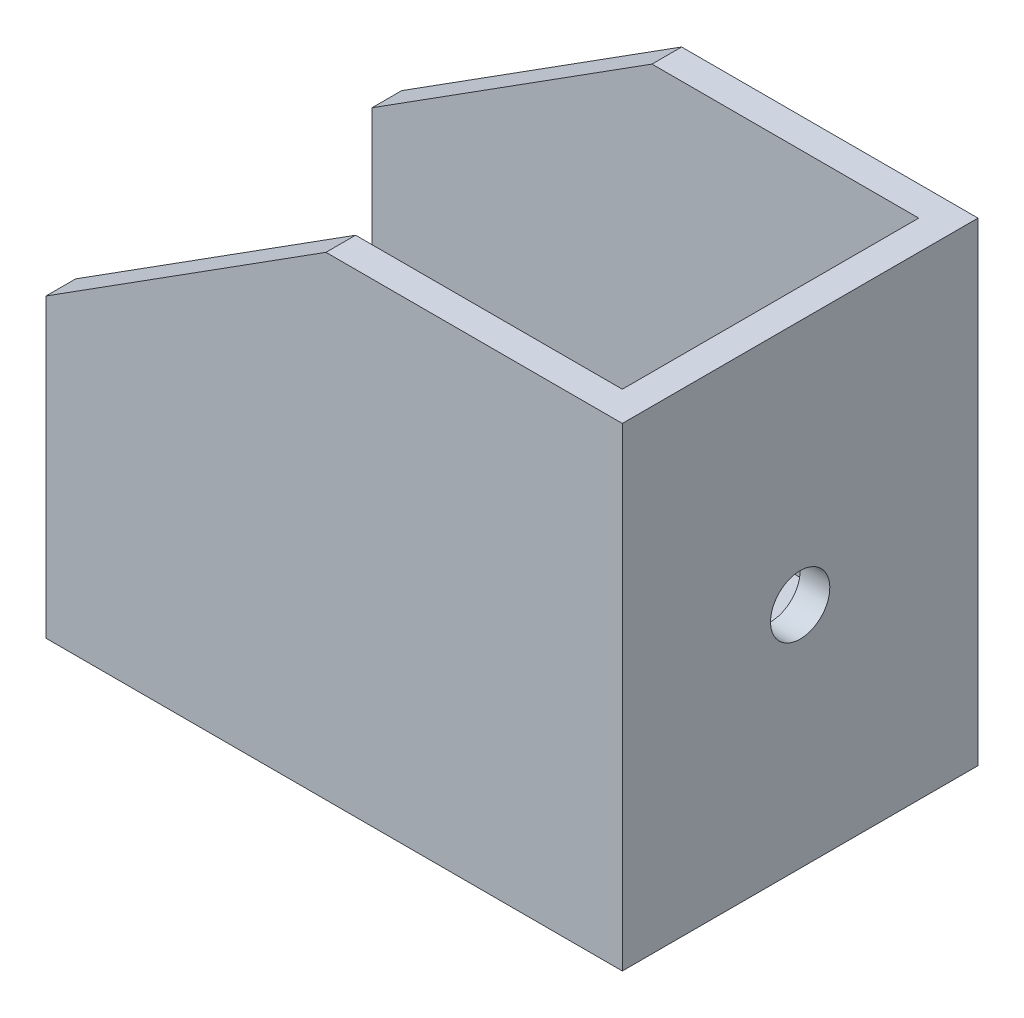
ISO-10303-21;
HEADER;
FILE_DESCRIPTION(('STEP AP214'),'2;1');
FILE_NAME('part.step','',(''),(''),'','','');
FILE_SCHEMA(('AUTOMOTIVE_DESIGN { 1 0 10303 214 1 1 1 1 }'));
ENDSEC;
DATA;
#1=APPLICATION_CONTEXT('core data for automotive mechanical design processes');
#2=APPLICATION_PROTOCOL_DEFINITION('international standard','automotive_design',2000,#1);
#3=PRODUCT_CONTEXT('',#1,'mechanical');
#4=PRODUCT('Part','Part','',(#3));
#5=PRODUCT_RELATED_PRODUCT_CATEGORY('part','',(#4));
#6=PRODUCT_DEFINITION_FORMATION('','',#4);
#7=PRODUCT_DEFINITION_CONTEXT('part definition',#1,'design');
#8=PRODUCT_DEFINITION('design','',#6,#7);
#9=PRODUCT_DEFINITION_SHAPE('','',#8);
#10=(LENGTH_UNIT() NAMED_UNIT(*) SI_UNIT(.MILLI.,.METRE.));
#11=(NAMED_UNIT(*) PLANE_ANGLE_UNIT() SI_UNIT($,.RADIAN.));
#12=(NAMED_UNIT(*) SI_UNIT($,.STERADIAN.) SOLID_ANGLE_UNIT());
#13=UNCERTAINTY_MEASURE_WITH_UNIT(LENGTH_MEASURE(1.E-05),#10,'distance_accuracy_value','');
#14=(GEOMETRIC_REPRESENTATION_CONTEXT(3) GLOBAL_UNCERTAINTY_ASSIGNED_CONTEXT((#13)) GLOBAL_UNIT_ASSIGNED_CONTEXT((#10,
#11,#12)) REPRESENTATION_CONTEXT('',''));
#15=CARTESIAN_POINT('',(0.,0.,0.));
#16=DIRECTION('',(0.,0.,1.));
#17=DIRECTION('',(1.,0.,0.));
#18=AXIS2_PLACEMENT_3D('',#15,#16,#17);
#19=CARTESIAN_POINT('',(47.2258862129138,0.,60.));
#20=DIRECTION('',(0.536067929963821,-0.844174848277479,0.));
#21=DIRECTION('',(0.844174848277479,0.536067929963821,0.));
#22=AXIS2_PLACEMENT_3D('',#19,#20,#21);
#23=PLANE('',#22);
#24=DIRECTION('',(0.844174848277479,0.536067929963821,0.));
#25=VECTOR('',#24,1.);
#26=CARTESIAN_POINT('',(47.2258862129138,0.,5.));
#27=LINE('',#26,#25);
#28=CARTESIAN_POINT('',(0.,-29.9893832593106,5.));
#29=VERTEX_POINT('',#28);
#30=CARTESIAN_POINT('',(47.2258862129138,0.,5.));
#31=VERTEX_POINT('',#30);
#32=EDGE_CURVE('E131',#29,#31,#27,.T.);
#33=ORIENTED_EDGE('',*,*,#32,.T.);
#34=DIRECTION('',(0.,0.,-1.));
#35=VECTOR('',#34,1.);
#36=CARTESIAN_POINT('',(47.2258862129138,0.,60.));
#37=LINE('',#36,#35);
#38=CARTESIAN_POINT('',(47.2258862129138,0.,0.));
#39=VERTEX_POINT('',#38);
#40=EDGE_CURVE('E116',#31,#39,#37,.T.);
#41=ORIENTED_EDGE('',*,*,#40,.T.);
#42=DIRECTION('',(-0.844174848277479,-0.536067929963821,0.));
#43=VECTOR('',#42,1.);
#44=CARTESIAN_POINT('',(47.2258862129138,0.,0.));
#45=LINE('',#44,#43);
#46=CARTESIAN_POINT('',(0.,-29.9893832593106,0.));
#47=VERTEX_POINT('',#46);
#48=EDGE_CURVE('E134',#39,#47,#45,.T.);
#49=ORIENTED_EDGE('',*,*,#48,.T.);
#50=DIRECTION('',(0.,0.,-1.));
#51=VECTOR('',#50,1.);
#52=CARTESIAN_POINT('',(0.,-29.9893832593106,60.));
#53=LINE('',#52,#51);
#54=EDGE_CURVE('E117',#29,#47,#53,.T.);
#55=ORIENTED_EDGE('',*,*,#54,.F.);
#56=EDGE_LOOP('',(#33,#41,#49,#55));
#57=FACE_BOUND('',#56,.T.);
#58=ADVANCED_FACE('F33',(#57),#23,.F.);
#59=CARTESIAN_POINT('',(97.2258862129138,0.,60.));
#60=DIRECTION('',(-1.,0.,0.));
#61=DIRECTION('',(0.,-1.,0.));
#62=AXIS2_PLACEMENT_3D('',#59,#60,#61);
#63=PLANE('',#62);
#64=CARTESIAN_POINT('',(97.2258862129138,-41.5,30.));
#65=DIRECTION('',(-1.,0.,0.));
#66=DIRECTION('',(0.,-1.,0.));
#67=AXIS2_PLACEMENT_3D('',#64,#65,#66);
#68=CIRCLE('',#67,5.);
#69=CARTESIAN_POINT('',(97.2258862129138,-46.5,30.));
#70=VERTEX_POINT('',#69);
#71=EDGE_CURVE('E180',#70,#70,#68,.T.);
#72=ORIENTED_EDGE('',*,*,#71,.T.);
#73=EDGE_LOOP('',(#72));
#74=FACE_BOUND('',#73,.T.);
#75=DIRECTION('',(0.,1.,0.));
#76=VECTOR('',#75,1.);
#77=CARTESIAN_POINT('',(97.2258862129138,0.,0.));
#78=LINE('',#77,#76);
#79=CARTESIAN_POINT('',(97.2258862129138,-80.,0.));
#80=VERTEX_POINT('',#79);
#81=CARTESIAN_POINT('',(97.2258862129138,0.,0.));
#82=VERTEX_POINT('',#81);
#83=EDGE_CURVE('E127',#80,#82,#78,.T.);
#84=ORIENTED_EDGE('',*,*,#83,.T.);
#85=DIRECTION('',(0.,0.,-1.));
#86=VECTOR('',#85,1.);
#87=CARTESIAN_POINT('',(97.2258862129138,0.,60.));
#88=LINE('',#87,#86);
#89=CARTESIAN_POINT('',(97.2258862129138,0.,60.));
#90=VERTEX_POINT('',#89);
#91=EDGE_CURVE('E42',#90,#82,#88,.T.);
#92=ORIENTED_EDGE('',*,*,#91,.F.);
#93=DIRECTION('',(0.,1.,0.));
#94=VECTOR('',#93,1.);
#95=CARTESIAN_POINT('',(97.2258862129138,0.,60.));
#96=LINE('',#95,#94);
#97=CARTESIAN_POINT('',(97.2258862129138,-80.,60.));
#98=VERTEX_POINT('',#97);
#99=EDGE_CURVE('E140',#98,#90,#96,.T.);
#100=ORIENTED_EDGE('',*,*,#99,.F.);
#101=DIRECTION('',(0.,0.,-1.));
#102=VECTOR('',#101,1.);
#103=CARTESIAN_POINT('',(97.2258862129138,-80.,60.));
#104=LINE('',#103,#102);
#105=EDGE_CURVE('E123',#98,#80,#104,.T.);
#106=ORIENTED_EDGE('',*,*,#105,.T.);
#107=EDGE_LOOP('',(#84,#92,#100,#106));
#108=FACE_BOUND('',#107,.T.);
#109=ADVANCED_FACE('F35',(#74,#108),#63,.F.);
#110=CARTESIAN_POINT('',(97.2258862129138,0.,60.));
#111=DIRECTION('',(0.,-1.,0.));
#112=DIRECTION('',(1.,0.,0.));
#113=AXIS2_PLACEMENT_3D('',#110,#111,#112);
#114=PLANE('',#113);
#115=ORIENTED_EDGE('',*,*,#40,.F.);
#116=DIRECTION('',(-1.,0.,0.));
#117=VECTOR('',#116,1.);
#118=CARTESIAN_POINT('',(30.7088178413558,0.,5.));
#119=LINE('',#118,#117);
#120=CARTESIAN_POINT('',(92.2258862129138,0.,5.));
#121=VERTEX_POINT('',#120);
#122=EDGE_CURVE('E164',#121,#31,#119,.T.);
#123=ORIENTED_EDGE('',*,*,#122,.F.);
#124=DIRECTION('',(0.,0.,-1.));
#125=VECTOR('',#124,1.);
#126=CARTESIAN_POINT('',(92.2258862129138,0.,5.));
#127=LINE('',#126,#125);
#128=CARTESIAN_POINT('',(92.2258862129138,0.,55.));
#129=VERTEX_POINT('',#128);
#130=EDGE_CURVE('E207',#129,#121,#127,.T.);
#131=ORIENTED_EDGE('',*,*,#130,.F.);
#132=DIRECTION('',(1.,0.,0.));
#133=VECTOR('',#132,1.);
#134=CARTESIAN_POINT('',(30.7088178413558,0.,55.));
#135=LINE('',#134,#133);
#136=CARTESIAN_POINT('',(47.2258862129138,0.,55.));
#137=VERTEX_POINT('',#136);
#138=EDGE_CURVE('E206',#137,#129,#135,.T.);
#139=ORIENTED_EDGE('',*,*,#138,.F.);
#140=CARTESIAN_POINT('',(47.2258862129138,0.,60.));
#141=VERTEX_POINT('',#140);
#142=EDGE_CURVE('E143',#141,#137,#37,.T.);
#143=ORIENTED_EDGE('',*,*,#142,.F.);
#144=DIRECTION('',(-1.,0.,0.));
#145=VECTOR('',#144,1.);
#146=CARTESIAN_POINT('',(97.2258862129138,0.,60.));
#147=LINE('',#146,#145);
#148=EDGE_CURVE('E91',#90,#141,#147,.T.);
#149=ORIENTED_EDGE('',*,*,#148,.F.);
#150=ORIENTED_EDGE('',*,*,#91,.T.);
#151=DIRECTION('',(-1.,0.,0.));
#152=VECTOR('',#151,1.);
#153=CARTESIAN_POINT('',(97.2258862129138,0.,0.));
#154=LINE('',#153,#152);
#155=EDGE_CURVE('E130',#82,#39,#154,.T.);
#156=ORIENTED_EDGE('',*,*,#155,.T.);
#157=EDGE_LOOP('',(#115,#123,#131,#139,#143,#149,#150,#156));
#158=FACE_BOUND('',#157,.T.);
#159=ADVANCED_FACE('F147',(#158),#114,.F.);
#160=ORIENTED_EDGE('',*,*,#142,.T.);
#161=DIRECTION('',(-0.844174848277479,-0.536067929963821,0.));
#162=VECTOR('',#161,1.);
#163=CARTESIAN_POINT('',(47.2258862129138,0.,55.));
#164=LINE('',#163,#162);
#165=CARTESIAN_POINT('',(0.,-29.9893832593106,55.));
#166=VERTEX_POINT('',#165);
#167=EDGE_CURVE('E112',#137,#166,#164,.T.);
#168=ORIENTED_EDGE('',*,*,#167,.T.);
#169=CARTESIAN_POINT('',(0.,-29.9893832593106,60.));
#170=VERTEX_POINT('',#169);
#171=EDGE_CURVE('E108',#170,#166,#53,.T.);
#172=ORIENTED_EDGE('',*,*,#171,.F.);
#173=DIRECTION('',(-0.844174848277479,-0.536067929963821,0.));
#174=VECTOR('',#173,1.);
#175=CARTESIAN_POINT('',(47.2258862129138,0.,60.));
#176=LINE('',#175,#174);
#177=EDGE_CURVE('E97',#141,#170,#176,.T.);
#178=ORIENTED_EDGE('',*,*,#177,.F.);
#179=EDGE_LOOP('',(#160,#168,#172,#178));
#180=FACE_BOUND('',#179,.T.);
#181=ADVANCED_FACE('F109',(#180),#23,.F.);
#182=CARTESIAN_POINT('',(0.,-29.9893832593106,60.));
#183=DIRECTION('',(1.,0.,0.));
#184=DIRECTION('',(0.,1.,0.));
#185=AXIS2_PLACEMENT_3D('',#182,#183,#184);
#186=PLANE('',#185);
#187=DIRECTION('',(0.,0.,1.));
#188=VECTOR('',#187,1.);
#189=CARTESIAN_POINT('',(0.,-62.5,5.));
#190=LINE('',#189,#188);
#191=CARTESIAN_POINT('',(0.,-62.5,5.));
#192=VERTEX_POINT('',#191);
#193=CARTESIAN_POINT('',(0.,-62.5,55.));
#194=VERTEX_POINT('',#193);
#195=EDGE_CURVE('E177',#192,#194,#190,.T.);
#196=ORIENTED_EDGE('',*,*,#195,.F.);
#197=DIRECTION('',(0.,1.,0.));
#198=VECTOR('',#197,1.);
#199=CARTESIAN_POINT('',(0.,-29.9893832593106,5.));
#200=LINE('',#199,#198);
#201=EDGE_CURVE('E11',#192,#29,#200,.T.);
#202=ORIENTED_EDGE('',*,*,#201,.T.);
#203=ORIENTED_EDGE('',*,*,#54,.T.);
#204=DIRECTION('',(0.,-1.,0.));
#205=VECTOR('',#204,1.);
#206=CARTESIAN_POINT('',(0.,-29.9893832593106,0.));
#207=LINE('',#206,#205);
#208=CARTESIAN_POINT('',(0.,-80.,0.));
#209=VERTEX_POINT('',#208);
#210=EDGE_CURVE('E137',#47,#209,#207,.T.);
#211=ORIENTED_EDGE('',*,*,#210,.T.);
#212=DIRECTION('',(0.,0.,-1.));
#213=VECTOR('',#212,1.);
#214=CARTESIAN_POINT('',(0.,-80.,60.));
#215=LINE('',#214,#213);
#216=CARTESIAN_POINT('',(0.,-80.,60.));
#217=VERTEX_POINT('',#216);
#218=EDGE_CURVE('E121',#217,#209,#215,.T.);
#219=ORIENTED_EDGE('',*,*,#218,.F.);
#220=DIRECTION('',(0.,-1.,0.));
#221=VECTOR('',#220,1.);
#222=CARTESIAN_POINT('',(0.,-29.9893832593106,60.));
#223=LINE('',#222,#221);
#224=EDGE_CURVE('E101',#170,#217,#223,.T.);
#225=ORIENTED_EDGE('',*,*,#224,.F.);
#226=ORIENTED_EDGE('',*,*,#171,.T.);
#227=DIRECTION('',(0.,1.,0.));
#228=VECTOR('',#227,1.);
#229=CARTESIAN_POINT('',(0.,-62.5,55.));
#230=LINE('',#229,#228);
#231=EDGE_CURVE('E178',#194,#166,#230,.T.);
#232=ORIENTED_EDGE('',*,*,#231,.F.);
#233=EDGE_LOOP('',(#196,#202,#203,#211,#219,#225,#226,#232));
#234=FACE_BOUND('',#233,.T.);
#235=ADVANCED_FACE('F120',(#234),#186,.F.);
#236=CARTESIAN_POINT('',(0.,-80.,60.));
#237=DIRECTION('',(0.,1.,0.));
#238=DIRECTION('',(0.,0.,1.));
#239=AXIS2_PLACEMENT_3D('',#236,#237,#238);
#240=PLANE('',#239);
#241=CARTESIAN_POINT('',(82.2258862129138,-80.,15.));
#242=DIRECTION('',(0.,1.,0.));
#243=DIRECTION('',(-1.,0.,0.));
#244=AXIS2_PLACEMENT_3D('',#241,#242,#243);
#245=CIRCLE('',#244,1.5);
#246=CARTESIAN_POINT('',(80.7258862129138,-80.,15.));
#247=VERTEX_POINT('',#246);
#248=EDGE_CURVE('E346',#247,#247,#245,.T.);
#249=ORIENTED_EDGE('',*,*,#248,.T.);
#250=EDGE_LOOP('',(#249));
#251=FACE_BOUND('',#250,.T.);
#252=CARTESIAN_POINT('',(10.,-80.,45.));
#253=DIRECTION('',(0.,1.,0.));
#254=DIRECTION('',(-1.,0.,0.));
#255=AXIS2_PLACEMENT_3D('',#252,#253,#254);
#256=CIRCLE('',#255,1.5);
#257=CARTESIAN_POINT('',(8.50000000000001,-80.,45.));
#258=VERTEX_POINT('',#257);
#259=EDGE_CURVE('E350',#258,#258,#256,.T.);
#260=ORIENTED_EDGE('',*,*,#259,.T.);
#261=EDGE_LOOP('',(#260));
#262=FACE_BOUND('',#261,.T.);
#263=CARTESIAN_POINT('',(82.2258862129138,-80.,45.));
#264=DIRECTION('',(0.,1.,0.));
#265=DIRECTION('',(-1.,0.,0.));
#266=AXIS2_PLACEMENT_3D('',#263,#264,#265);
#267=CIRCLE('',#266,1.5);
#268=CARTESIAN_POINT('',(80.7258862129138,-80.,45.));
#269=VERTEX_POINT('',#268);
#270=EDGE_CURVE('E361',#269,#269,#267,.T.);
#271=ORIENTED_EDGE('',*,*,#270,.T.);
#272=EDGE_LOOP('',(#271));
#273=FACE_BOUND('',#272,.T.);
#274=CARTESIAN_POINT('',(10.,-80.,15.));
#275=DIRECTION('',(0.,1.,0.));
#276=DIRECTION('',(-1.,0.,0.));
#277=AXIS2_PLACEMENT_3D('',#274,#275,#276);
#278=CIRCLE('',#277,1.5);
#279=CARTESIAN_POINT('',(8.50000000000001,-80.,15.));
#280=VERTEX_POINT('',#279);
#281=EDGE_CURVE('E208',#280,#280,#278,.T.);
#282=ORIENTED_EDGE('',*,*,#281,.T.);
#283=EDGE_LOOP('',(#282));
#284=FACE_BOUND('',#283,.T.);
#285=DIRECTION('',(1.,0.,0.));
#286=VECTOR('',#285,1.);
#287=CARTESIAN_POINT('',(0.,-80.,0.));
#288=LINE('',#287,#286);
#289=EDGE_CURVE('E82',#209,#80,#288,.T.);
#290=ORIENTED_EDGE('',*,*,#289,.T.);
#291=ORIENTED_EDGE('',*,*,#105,.F.);
#292=DIRECTION('',(1.,0.,0.));
#293=VECTOR('',#292,1.);
#294=CARTESIAN_POINT('',(0.,-80.,60.));
#295=LINE('',#294,#293);
#296=EDGE_CURVE('E58',#217,#98,#295,.T.);
#297=ORIENTED_EDGE('',*,*,#296,.F.);
#298=ORIENTED_EDGE('',*,*,#218,.T.);
#299=EDGE_LOOP('',(#290,#291,#297,#298));
#300=FACE_BOUND('',#299,.T.);
#301=ADVANCED_FACE('F248',(#251,#262,#273,#284,#300),#240,.F.);
#302=CARTESIAN_POINT('',(0.,0.,60.));
#303=DIRECTION('',(0.,0.,1.));
#304=DIRECTION('',(1.,0.,0.));
#305=AXIS2_PLACEMENT_3D('',#302,#303,#304);
#306=PLANE('',#305);
#307=ORIENTED_EDGE('',*,*,#99,.T.);
#308=ORIENTED_EDGE('',*,*,#148,.T.);
#309=ORIENTED_EDGE('',*,*,#177,.T.);
#310=ORIENTED_EDGE('',*,*,#224,.T.);
#311=ORIENTED_EDGE('',*,*,#296,.T.);
#312=EDGE_LOOP('',(#307,#308,#309,#310,#311));
#313=FACE_BOUND('',#312,.T.);
#314=ADVANCED_FACE('F99',(#313),#306,.T.);
#315=CARTESIAN_POINT('',(0.,0.,0.));
#316=DIRECTION('',(0.,0.,1.));
#317=DIRECTION('',(1.,0.,0.));
#318=AXIS2_PLACEMENT_3D('',#315,#316,#317);
#319=PLANE('',#318);
#320=ORIENTED_EDGE('',*,*,#83,.F.);
#321=ORIENTED_EDGE('',*,*,#289,.F.);
#322=ORIENTED_EDGE('',*,*,#210,.F.);
#323=ORIENTED_EDGE('',*,*,#48,.F.);
#324=ORIENTED_EDGE('',*,*,#155,.F.);
#325=EDGE_LOOP('',(#320,#321,#322,#323,#324));
#326=FACE_BOUND('',#325,.T.);
#327=ADVANCED_FACE('F153',(#326),#319,.F.);
#328=CARTESIAN_POINT('',(80.,-62.5,5.));
#329=DIRECTION('',(0.,0.,-1.));
#330=DIRECTION('',(-1.,0.,0.));
#331=AXIS2_PLACEMENT_3D('',#328,#329,#330);
#332=PLANE('',#331);
#333=ORIENTED_EDGE('',*,*,#122,.T.);
#334=ORIENTED_EDGE('',*,*,#32,.F.);
#335=ORIENTED_EDGE('',*,*,#201,.F.);
#336=DIRECTION('',(-1.,0.,0.));
#337=VECTOR('',#336,1.);
#338=CARTESIAN_POINT('',(80.,-62.5,5.));
#339=LINE('',#338,#337);
#340=CARTESIAN_POINT('',(92.2258862129138,-62.5,5.));
#341=VERTEX_POINT('',#340);
#342=EDGE_CURVE('E49',#341,#192,#339,.T.);
#343=ORIENTED_EDGE('',*,*,#342,.F.);
#344=DIRECTION('',(0.,1.,0.));
#345=VECTOR('',#344,1.);
#346=CARTESIAN_POINT('',(92.2258862129138,-62.5,5.));
#347=LINE('',#346,#345);
#348=EDGE_CURVE('E215',#341,#121,#347,.T.);
#349=ORIENTED_EDGE('',*,*,#348,.T.);
#350=EDGE_LOOP('',(#333,#334,#335,#343,#349));
#351=FACE_BOUND('',#350,.T.);
#352=ADVANCED_FACE('F174',(#351),#332,.F.);
#353=CARTESIAN_POINT('',(80.,-62.5,55.));
#354=DIRECTION('',(0.,0.,1.));
#355=DIRECTION('',(1.,0.,0.));
#356=AXIS2_PLACEMENT_3D('',#353,#354,#355);
#357=PLANE('',#356);
#358=ORIENTED_EDGE('',*,*,#167,.F.);
#359=ORIENTED_EDGE('',*,*,#138,.T.);
#360=DIRECTION('',(0.,1.,0.));
#361=VECTOR('',#360,1.);
#362=CARTESIAN_POINT('',(92.2258862129138,-62.5,55.));
#363=LINE('',#362,#361);
#364=CARTESIAN_POINT('',(92.2258862129138,-62.5,55.));
#365=VERTEX_POINT('',#364);
#366=EDGE_CURVE('E197',#365,#129,#363,.T.);
#367=ORIENTED_EDGE('',*,*,#366,.F.);
#368=DIRECTION('',(-1.,0.,0.));
#369=VECTOR('',#368,1.);
#370=CARTESIAN_POINT('',(80.,-62.5,55.));
#371=LINE('',#370,#369);
#372=EDGE_CURVE('E187',#365,#194,#371,.T.);
#373=ORIENTED_EDGE('',*,*,#372,.T.);
#374=ORIENTED_EDGE('',*,*,#231,.T.);
#375=EDGE_LOOP('',(#358,#359,#367,#373,#374));
#376=FACE_BOUND('',#375,.T.);
#377=ADVANCED_FACE('F193',(#376),#357,.F.);
#378=CARTESIAN_POINT('',(80.,-62.5,5.));
#379=DIRECTION('',(0.,-1.,0.));
#380=DIRECTION('',(1.,0.,0.));
#381=AXIS2_PLACEMENT_3D('',#378,#379,#380);
#382=PLANE('',#381);
#383=CARTESIAN_POINT('',(82.2258862129138,-62.5,15.));
#384=DIRECTION('',(0.,1.,0.));
#385=DIRECTION('',(-1.,0.,0.));
#386=AXIS2_PLACEMENT_3D('',#383,#384,#385);
#387=CIRCLE('',#386,1.5);
#388=CARTESIAN_POINT('',(80.7258862129138,-62.5,15.));
#389=VERTEX_POINT('',#388);
#390=EDGE_CURVE('E349',#389,#389,#387,.T.);
#391=ORIENTED_EDGE('',*,*,#390,.F.);
#392=EDGE_LOOP('',(#391));
#393=FACE_BOUND('',#392,.T.);
#394=CARTESIAN_POINT('',(10.,-62.5,45.));
#395=DIRECTION('',(0.,1.,0.));
#396=DIRECTION('',(-1.,0.,0.));
#397=AXIS2_PLACEMENT_3D('',#394,#395,#396);
#398=CIRCLE('',#397,1.5);
#399=CARTESIAN_POINT('',(8.50000000000001,-62.5,45.));
#400=VERTEX_POINT('',#399);
#401=EDGE_CURVE('E355',#400,#400,#398,.T.);
#402=ORIENTED_EDGE('',*,*,#401,.F.);
#403=EDGE_LOOP('',(#402));
#404=FACE_BOUND('',#403,.T.);
#405=CARTESIAN_POINT('',(82.2258862129138,-62.5,45.));
#406=DIRECTION('',(0.,1.,0.));
#407=DIRECTION('',(-1.,0.,0.));
#408=AXIS2_PLACEMENT_3D('',#405,#406,#407);
#409=CIRCLE('',#408,1.5);
#410=CARTESIAN_POINT('',(80.7258862129138,-62.5,45.));
#411=VERTEX_POINT('',#410);
#412=EDGE_CURVE('E410',#411,#411,#409,.T.);
#413=ORIENTED_EDGE('',*,*,#412,.F.);
#414=EDGE_LOOP('',(#413));
#415=FACE_BOUND('',#414,.T.);
#416=CARTESIAN_POINT('',(10.,-62.5,15.));
#417=DIRECTION('',(0.,1.,0.));
#418=DIRECTION('',(-1.,0.,0.));
#419=AXIS2_PLACEMENT_3D('',#416,#417,#418);
#420=CIRCLE('',#419,1.5);
#421=CARTESIAN_POINT('',(8.50000000000001,-62.5,15.));
#422=VERTEX_POINT('',#421);
#423=EDGE_CURVE('E352',#422,#422,#420,.T.);
#424=ORIENTED_EDGE('',*,*,#423,.F.);
#425=EDGE_LOOP('',(#424));
#426=FACE_BOUND('',#425,.T.);
#427=ORIENTED_EDGE('',*,*,#195,.T.);
#428=ORIENTED_EDGE('',*,*,#372,.F.);
#429=DIRECTION('',(0.,0.,-1.));
#430=VECTOR('',#429,1.);
#431=CARTESIAN_POINT('',(92.2258862129138,-62.5,5.));
#432=LINE('',#431,#430);
#433=EDGE_CURVE('E200',#365,#341,#432,.T.);
#434=ORIENTED_EDGE('',*,*,#433,.T.);
#435=ORIENTED_EDGE('',*,*,#342,.T.);
#436=EDGE_LOOP('',(#427,#428,#434,#435));
#437=FACE_BOUND('',#436,.T.);
#438=ADVANCED_FACE('F199',(#393,#404,#415,#426,#437),#382,.F.);
#439=CARTESIAN_POINT('',(160.,-41.5,30.));
#440=DIRECTION('',(-1.,0.,0.));
#441=DIRECTION('',(0.,-1.,0.));
#442=AXIS2_PLACEMENT_3D('',#439,#440,#441);
#443=CYLINDRICAL_SURFACE('',#442,5.);
#444=CARTESIAN_POINT('',(92.2258862129138,-41.5,30.));
#445=DIRECTION('',(1.,0.,0.));
#446=DIRECTION('',(0.,0.,-1.));
#447=AXIS2_PLACEMENT_3D('',#444,#445,#446);
#448=CIRCLE('',#447,5.);
#449=CARTESIAN_POINT('',(92.2258862129138,-41.5,25.));
#450=VERTEX_POINT('',#449);
#451=EDGE_CURVE('E37',#450,#450,#448,.F.);
#452=ORIENTED_EDGE('',*,*,#451,.T.);
#453=EDGE_LOOP('',(#452));
#454=FACE_BOUND('',#453,.T.);
#455=ORIENTED_EDGE('',*,*,#71,.F.);
#456=EDGE_LOOP('',(#455));
#457=FACE_BOUND('',#456,.T.);
#458=ADVANCED_FACE('F223',(#454,#457),#443,.F.);
#459=CARTESIAN_POINT('',(92.2258862129138,-62.5,5.));
#460=DIRECTION('',(1.,0.,0.));
#461=DIRECTION('',(0.,0.,-1.));
#462=AXIS2_PLACEMENT_3D('',#459,#460,#461);
#463=PLANE('',#462);
#464=ORIENTED_EDGE('',*,*,#130,.T.);
#465=ORIENTED_EDGE('',*,*,#348,.F.);
#466=ORIENTED_EDGE('',*,*,#433,.F.);
#467=ORIENTED_EDGE('',*,*,#366,.T.);
#468=EDGE_LOOP('',(#464,#465,#466,#467));
#469=FACE_BOUND('',#468,.T.);
#470=ORIENTED_EDGE('',*,*,#451,.F.);
#471=EDGE_LOOP('',(#470));
#472=FACE_BOUND('',#471,.T.);
#473=ADVANCED_FACE('F212',(#469,#472),#463,.F.);
#474=CARTESIAN_POINT('',(10.,-80.,15.));
#475=DIRECTION('',(0.,1.,0.));
#476=DIRECTION('',(-1.,0.,0.));
#477=AXIS2_PLACEMENT_3D('',#474,#475,#476);
#478=CYLINDRICAL_SURFACE('',#477,1.5);
#479=ORIENTED_EDGE('',*,*,#281,.F.);
#480=EDGE_LOOP('',(#479));
#481=FACE_BOUND('',#480,.T.);
#482=ORIENTED_EDGE('',*,*,#423,.T.);
#483=EDGE_LOOP('',(#482));
#484=FACE_BOUND('',#483,.T.);
#485=ADVANCED_FACE('F226',(#481,#484),#478,.F.);
#486=CARTESIAN_POINT('',(82.2258862129138,-80.,45.));
#487=DIRECTION('',(0.,1.,0.));
#488=DIRECTION('',(-1.,0.,0.));
#489=AXIS2_PLACEMENT_3D('',#486,#487,#488);
#490=CYLINDRICAL_SURFACE('',#489,1.5);
#491=ORIENTED_EDGE('',*,*,#270,.F.);
#492=EDGE_LOOP('',(#491));
#493=FACE_BOUND('',#492,.T.);
#494=ORIENTED_EDGE('',*,*,#412,.T.);
#495=EDGE_LOOP('',(#494));
#496=FACE_BOUND('',#495,.T.);
#497=ADVANCED_FACE('F232',(#493,#496),#490,.F.);
#498=CARTESIAN_POINT('',(10.,-80.,45.));
#499=DIRECTION('',(0.,1.,0.));
#500=DIRECTION('',(-1.,0.,0.));
#501=AXIS2_PLACEMENT_3D('',#498,#499,#500);
#502=CYLINDRICAL_SURFACE('',#501,1.5);
#503=ORIENTED_EDGE('',*,*,#259,.F.);
#504=EDGE_LOOP('',(#503));
#505=FACE_BOUND('',#504,.T.);
#506=ORIENTED_EDGE('',*,*,#401,.T.);
#507=EDGE_LOOP('',(#506));
#508=FACE_BOUND('',#507,.T.);
#509=ADVANCED_FACE('F319',(#505,#508),#502,.F.);
#510=CARTESIAN_POINT('',(82.2258862129138,-80.,15.));
#511=DIRECTION('',(0.,1.,0.));
#512=DIRECTION('',(-1.,0.,0.));
#513=AXIS2_PLACEMENT_3D('',#510,#511,#512);
#514=CYLINDRICAL_SURFACE('',#513,1.5);
#515=ORIENTED_EDGE('',*,*,#248,.F.);
#516=EDGE_LOOP('',(#515));
#517=FACE_BOUND('',#516,.T.);
#518=ORIENTED_EDGE('',*,*,#390,.T.);
#519=EDGE_LOOP('',(#518));
#520=FACE_BOUND('',#519,.T.);
#521=ADVANCED_FACE('F328',(#517,#520),#514,.F.);
#522=CLOSED_SHELL('',(#58,#109,#159,#181,#235,#301,#314,#327,#352,#377,#438,#458,#473,#485,#497,
#509,#521));
#523=MANIFOLD_SOLID_BREP('B2',#522);
#524=ADVANCED_BREP_SHAPE_REPRESENTATION('',(#18,#523),#14);
#525=SHAPE_DEFINITION_REPRESENTATION(#9,#524);
ENDSEC;
END-ISO-10303-21;
